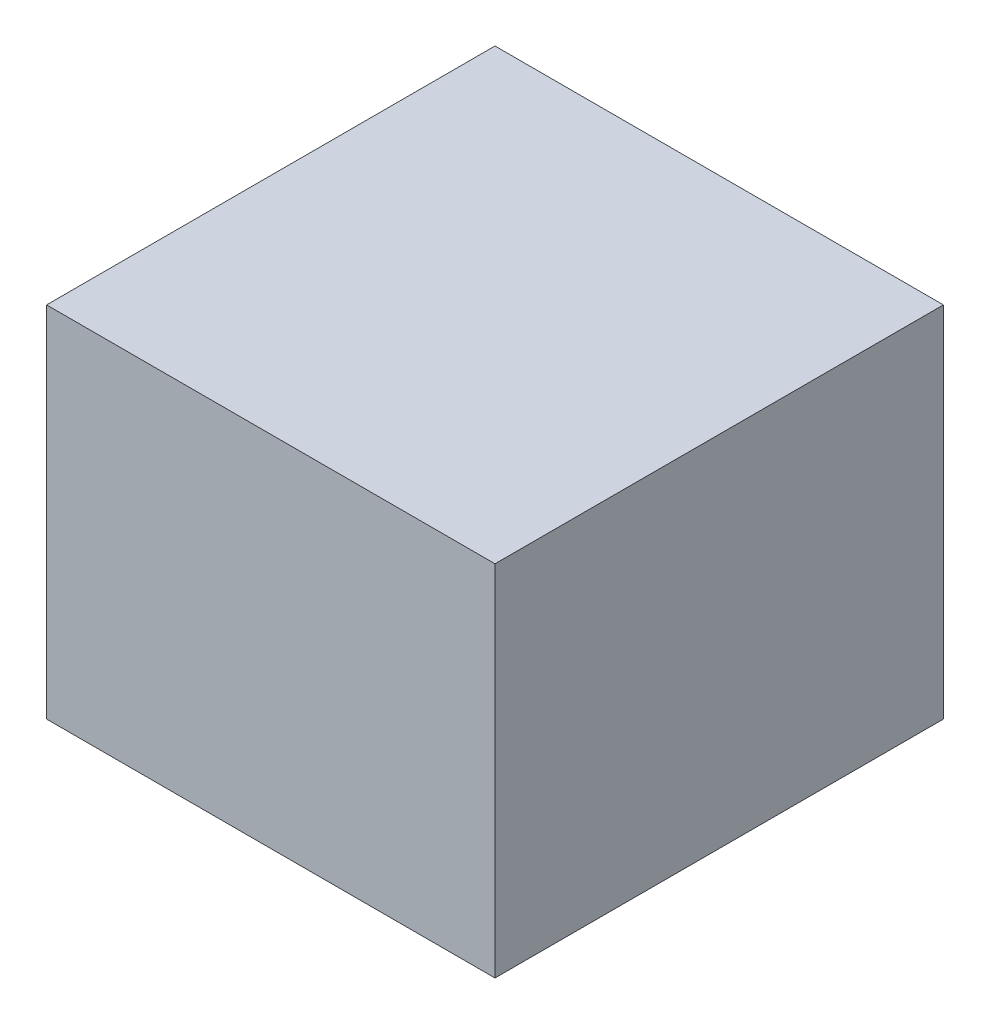
ISO-10303-21;
HEADER;
FILE_DESCRIPTION(('STEP AP214'),'2;1');
FILE_NAME('part.step','',(''),(''),'','','');
FILE_SCHEMA(('AUTOMOTIVE_DESIGN { 1 0 10303 214 1 1 1 1 }'));
ENDSEC;
DATA;
#1=APPLICATION_CONTEXT('core data for automotive mechanical design processes');
#2=APPLICATION_PROTOCOL_DEFINITION('international standard','automotive_design',2000,#1);
#3=PRODUCT_CONTEXT('',#1,'mechanical');
#4=PRODUCT('Part','Part','',(#3));
#5=PRODUCT_RELATED_PRODUCT_CATEGORY('part','',(#4));
#6=PRODUCT_DEFINITION_FORMATION('','',#4);
#7=PRODUCT_DEFINITION_CONTEXT('part definition',#1,'design');
#8=PRODUCT_DEFINITION('design','',#6,#7);
#9=PRODUCT_DEFINITION_SHAPE('','',#8);
#10=(LENGTH_UNIT() NAMED_UNIT(*) SI_UNIT(.MILLI.,.METRE.));
#11=(NAMED_UNIT(*) PLANE_ANGLE_UNIT() SI_UNIT($,.RADIAN.));
#12=(NAMED_UNIT(*) SI_UNIT($,.STERADIAN.) SOLID_ANGLE_UNIT());
#13=UNCERTAINTY_MEASURE_WITH_UNIT(LENGTH_MEASURE(1.E-05),#10,'distance_accuracy_value','');
#14=(GEOMETRIC_REPRESENTATION_CONTEXT(3) GLOBAL_UNCERTAINTY_ASSIGNED_CONTEXT((#13)) GLOBAL_UNIT_ASSIGNED_CONTEXT((#10,
#11,#12)) REPRESENTATION_CONTEXT('',''));
#15=CARTESIAN_POINT('',(0.,0.,0.));
#16=DIRECTION('',(0.,0.,1.));
#17=DIRECTION('',(1.,0.,0.));
#18=AXIS2_PLACEMENT_3D('',#15,#16,#17);
#19=CARTESIAN_POINT('',(-6.5,20.,6.5));
#20=DIRECTION('',(0.,-1.,0.));
#21=DIRECTION('',(0.,0.,-1.));
#22=AXIS2_PLACEMENT_3D('',#19,#20,#21);
#23=CYLINDRICAL_SURFACE('',#22,2.5);
#24=CARTESIAN_POINT('',(-6.5,0.,6.5));
#25=DIRECTION('',(0.,1.,0.));
#26=DIRECTION('',(0.,0.,1.));
#27=AXIS2_PLACEMENT_3D('',#24,#25,#26);
#28=CIRCLE('',#27,2.5);
#29=CARTESIAN_POINT('',(-6.5,0.,9.));
#30=VERTEX_POINT('',#29);
#31=EDGE_CURVE('E291',#30,#30,#28,.T.);
#32=ORIENTED_EDGE('',*,*,#31,.F.);
#33=EDGE_LOOP('',(#32));
#34=FACE_BOUND('',#33,.T.);
#35=CARTESIAN_POINT('',(-6.5,11.9152542372881,6.5));
#36=DIRECTION('',(0.836314214990173,0.548250429826891,0.));
#37=DIRECTION('',(0.548250429826891,-0.836314214990173,0.));
#38=AXIS2_PLACEMENT_3D('',#35,#36,#37);
#39=ELLIPSE('',#38,4.55995994529246,2.5);
#40=CARTESIAN_POINT('',(-4.73223304703363,9.21866058022079,4.73223304703363));
#41=VERTEX_POINT('',#40);
#42=CARTESIAN_POINT('',(-8.26776695296637,14.6118478943555,8.26776695296637));
#43=VERTEX_POINT('',#42);
#44=EDGE_CURVE('E280',#41,#43,#39,.T.);
#45=ORIENTED_EDGE('',*,*,#44,.T.);
#46=CARTESIAN_POINT('',(-6.5,11.9152542372881,6.5));
#47=DIRECTION('',(0.,0.548250429826891,-0.836314214990173));
#48=DIRECTION('',(0.,-0.836314214990173,-0.548250429826891));
#49=AXIS2_PLACEMENT_3D('',#46,#47,#48);
#50=ELLIPSE('',#49,4.55995994529246,2.5);
#51=EDGE_CURVE('E210',#43,#41,#50,.T.);
#52=ORIENTED_EDGE('',*,*,#51,.T.);
#53=EDGE_LOOP('',(#45,#52));
#54=FACE_BOUND('',#53,.T.);
#55=ADVANCED_FACE('F39',(#34,#54),#23,.F.);
#56=CARTESIAN_POINT('',(-6.5,20.,-6.5));
#57=DIRECTION('',(0.,-1.,0.));
#58=DIRECTION('',(0.,0.,-1.));
#59=AXIS2_PLACEMENT_3D('',#56,#57,#58);
#60=CYLINDRICAL_SURFACE('',#59,2.5);
#61=CARTESIAN_POINT('',(-6.5,0.,-6.5));
#62=DIRECTION('',(0.,1.,0.));
#63=DIRECTION('',(0.,0.,-1.));
#64=AXIS2_PLACEMENT_3D('',#61,#62,#63);
#65=CIRCLE('',#64,2.5);
#66=CARTESIAN_POINT('',(-6.5,0.,-9.));
#67=VERTEX_POINT('',#66);
#68=EDGE_CURVE('E288',#67,#67,#65,.T.);
#69=ORIENTED_EDGE('',*,*,#68,.F.);
#70=EDGE_LOOP('',(#69));
#71=FACE_BOUND('',#70,.T.);
#72=CARTESIAN_POINT('',(-6.5,11.9152542372881,-6.5));
#73=DIRECTION('',(0.,0.548250429826891,0.836314214990173));
#74=DIRECTION('',(0.,-0.836314214990173,0.548250429826891));
#75=AXIS2_PLACEMENT_3D('',#72,#73,#74);
#76=ELLIPSE('',#75,4.55995994529246,2.5);
#77=CARTESIAN_POINT('',(-4.73223304703363,9.21866058022079,-4.73223304703363));
#78=VERTEX_POINT('',#77);
#79=CARTESIAN_POINT('',(-8.26776695296637,14.6118478943555,-8.26776695296637));
#80=VERTEX_POINT('',#79);
#81=EDGE_CURVE('E207',#78,#80,#76,.T.);
#82=ORIENTED_EDGE('',*,*,#81,.T.);
#83=CARTESIAN_POINT('',(-6.5,11.9152542372881,-6.5));
#84=DIRECTION('',(0.836314214990173,0.548250429826891,0.));
#85=DIRECTION('',(0.548250429826891,-0.836314214990173,0.));
#86=AXIS2_PLACEMENT_3D('',#83,#84,#85);
#87=ELLIPSE('',#86,4.55995994529246,2.5);
#88=EDGE_CURVE('E12',#80,#78,#87,.T.);
#89=ORIENTED_EDGE('',*,*,#88,.T.);
#90=EDGE_LOOP('',(#82,#89));
#91=FACE_BOUND('',#90,.T.);
#92=ADVANCED_FACE('F327',(#71,#91),#60,.F.);
#93=CARTESIAN_POINT('',(6.5,20.,6.5));
#94=DIRECTION('',(0.,-1.,0.));
#95=DIRECTION('',(0.,0.,-1.));
#96=AXIS2_PLACEMENT_3D('',#93,#94,#95);
#97=CYLINDRICAL_SURFACE('',#96,2.5);
#98=CARTESIAN_POINT('',(6.5,0.,6.5));
#99=DIRECTION('',(0.,1.,0.));
#100=DIRECTION('',(0.,0.,-1.));
#101=AXIS2_PLACEMENT_3D('',#98,#99,#100);
#102=CIRCLE('',#101,2.5);
#103=CARTESIAN_POINT('',(6.5,0.,4.));
#104=VERTEX_POINT('',#103);
#105=EDGE_CURVE('E285',#104,#104,#102,.T.);
#106=ORIENTED_EDGE('',*,*,#105,.F.);
#107=EDGE_LOOP('',(#106));
#108=FACE_BOUND('',#107,.T.);
#109=CARTESIAN_POINT('',(6.5,11.9152542372881,6.5));
#110=DIRECTION('',(-0.836314214990173,0.548250429826891,0.));
#111=DIRECTION('',(-0.548250429826891,-0.836314214990173,0.));
#112=AXIS2_PLACEMENT_3D('',#109,#110,#111);
#113=ELLIPSE('',#112,4.55995994529246,2.5);
#114=CARTESIAN_POINT('',(8.26776695296637,14.6118478943555,8.26776695296637));
#115=VERTEX_POINT('',#114);
#116=CARTESIAN_POINT('',(4.73223304703363,9.21866058022079,4.73223304703363));
#117=VERTEX_POINT('',#116);
#118=EDGE_CURVE('E268',#115,#117,#113,.T.);
#119=ORIENTED_EDGE('',*,*,#118,.T.);
#120=CARTESIAN_POINT('',(6.5,11.9152542372881,6.5));
#121=DIRECTION('',(0.,0.548250429826891,-0.836314214990173));
#122=DIRECTION('',(0.,-0.836314214990173,-0.548250429826891));
#123=AXIS2_PLACEMENT_3D('',#120,#121,#122);
#124=ELLIPSE('',#123,4.55995994529246,2.5);
#125=EDGE_CURVE('E49',#117,#115,#124,.T.);
#126=ORIENTED_EDGE('',*,*,#125,.T.);
#127=EDGE_LOOP('',(#119,#126));
#128=FACE_BOUND('',#127,.T.);
#129=ADVANCED_FACE('F333',(#108,#128),#97,.F.);
#130=CARTESIAN_POINT('',(6.5,20.,-6.5));
#131=DIRECTION('',(0.,-1.,0.));
#132=DIRECTION('',(0.,0.,-1.));
#133=AXIS2_PLACEMENT_3D('',#130,#131,#132);
#134=CYLINDRICAL_SURFACE('',#133,2.5);
#135=CARTESIAN_POINT('',(6.5,0.,-6.5));
#136=DIRECTION('',(0.,1.,0.));
#137=DIRECTION('',(0.,0.,1.));
#138=AXIS2_PLACEMENT_3D('',#135,#136,#137);
#139=CIRCLE('',#138,2.5);
#140=CARTESIAN_POINT('',(6.5,0.,-4.));
#141=VERTEX_POINT('',#140);
#142=EDGE_CURVE('E282',#141,#141,#139,.T.);
#143=ORIENTED_EDGE('',*,*,#142,.F.);
#144=EDGE_LOOP('',(#143));
#145=FACE_BOUND('',#144,.T.);
#146=CARTESIAN_POINT('',(6.5,11.9152542372881,-6.5));
#147=DIRECTION('',(0.,0.548250429826891,0.836314214990173));
#148=DIRECTION('',(0.,-0.836314214990173,0.548250429826891));
#149=AXIS2_PLACEMENT_3D('',#146,#147,#148);
#150=ELLIPSE('',#149,4.55995994529246,2.5);
#151=CARTESIAN_POINT('',(8.26776695296636,14.6118478943555,-8.26776695296637));
#152=VERTEX_POINT('',#151);
#153=CARTESIAN_POINT('',(4.73223304703363,9.21866058022079,-4.73223304703363));
#154=VERTEX_POINT('',#153);
#155=EDGE_CURVE('E307',#152,#154,#150,.T.);
#156=ORIENTED_EDGE('',*,*,#155,.T.);
#157=CARTESIAN_POINT('',(6.5,11.9152542372881,-6.5));
#158=DIRECTION('',(-0.836314214990173,0.548250429826891,0.));
#159=DIRECTION('',(-0.548250429826891,-0.836314214990173,0.));
#160=AXIS2_PLACEMENT_3D('',#157,#158,#159);
#161=ELLIPSE('',#160,4.55995994529246,2.5);
#162=EDGE_CURVE('E310',#154,#152,#161,.T.);
#163=ORIENTED_EDGE('',*,*,#162,.T.);
#164=EDGE_LOOP('',(#156,#163));
#165=FACE_BOUND('',#164,.T.);
#166=ADVANCED_FACE('F342',(#145,#165),#134,.F.);
#167=CARTESIAN_POINT('',(0.,0.,0.));
#168=DIRECTION('',(0.,1.,0.));
#169=DIRECTION('',(0.,0.,1.));
#170=AXIS2_PLACEMENT_3D('',#167,#168,#169);
#171=PLANE('',#170);
#172=ORIENTED_EDGE('',*,*,#105,.T.);
#173=EDGE_LOOP('',(#172));
#174=FACE_BOUND('',#173,.T.);
#175=ORIENTED_EDGE('',*,*,#31,.T.);
#176=EDGE_LOOP('',(#175));
#177=FACE_BOUND('',#176,.T.);
#178=DIRECTION('',(0.,0.,-1.));
#179=VECTOR('',#178,1.);
#180=CARTESIAN_POINT('',(13.,0.,-13.));
#181=LINE('',#180,#179);
#182=CARTESIAN_POINT('',(13.,0.,13.));
#183=VERTEX_POINT('',#182);
#184=CARTESIAN_POINT('',(13.,0.,-13.));
#185=VERTEX_POINT('',#184);
#186=EDGE_CURVE('E294',#183,#185,#181,.T.);
#187=ORIENTED_EDGE('',*,*,#186,.F.);
#188=DIRECTION('',(1.,0.,0.));
#189=VECTOR('',#188,1.);
#190=CARTESIAN_POINT('',(-13.,0.,13.));
#191=LINE('',#190,#189);
#192=CARTESIAN_POINT('',(-13.,0.,13.));
#193=VERTEX_POINT('',#192);
#194=EDGE_CURVE('E300',#193,#183,#191,.T.);
#195=ORIENTED_EDGE('',*,*,#194,.F.);
#196=DIRECTION('',(0.,0.,1.));
#197=VECTOR('',#196,1.);
#198=CARTESIAN_POINT('',(-13.,0.,-13.));
#199=LINE('',#198,#197);
#200=CARTESIAN_POINT('',(-13.,0.,-13.));
#201=VERTEX_POINT('',#200);
#202=EDGE_CURVE('E131',#201,#193,#199,.T.);
#203=ORIENTED_EDGE('',*,*,#202,.F.);
#204=DIRECTION('',(-1.,0.,0.));
#205=VECTOR('',#204,1.);
#206=CARTESIAN_POINT('',(-13.,0.,-13.));
#207=LINE('',#206,#205);
#208=EDGE_CURVE('E297',#185,#201,#207,.T.);
#209=ORIENTED_EDGE('',*,*,#208,.F.);
#210=EDGE_LOOP('',(#187,#195,#203,#209));
#211=FACE_BOUND('',#210,.T.);
#212=ORIENTED_EDGE('',*,*,#68,.T.);
#213=EDGE_LOOP('',(#212));
#214=FACE_BOUND('',#213,.T.);
#215=ORIENTED_EDGE('',*,*,#142,.T.);
#216=EDGE_LOOP('',(#215));
#217=FACE_BOUND('',#216,.T.);
#218=ADVANCED_FACE('F339',(#174,#177,#211,#214,#217),#171,.F.);
#219=CARTESIAN_POINT('',(13.,20.,-13.));
#220=DIRECTION('',(-1.,0.,0.));
#221=DIRECTION('',(0.,0.,1.));
#222=AXIS2_PLACEMENT_3D('',#219,#220,#221);
#223=PLANE('',#222);
#224=ORIENTED_EDGE('',*,*,#186,.T.);
#225=DIRECTION('',(0.,-1.,0.));
#226=VECTOR('',#225,1.);
#227=CARTESIAN_POINT('',(13.,20.,-13.));
#228=LINE('',#227,#226);
#229=CARTESIAN_POINT('',(13.,20.8,-13.));
#230=VERTEX_POINT('',#229);
#231=EDGE_CURVE('E304',#230,#185,#228,.T.);
#232=ORIENTED_EDGE('',*,*,#231,.F.);
#233=DIRECTION('',(0.,0.,-1.));
#234=VECTOR('',#233,1.);
#235=CARTESIAN_POINT('',(13.,20.8,13.));
#236=LINE('',#235,#234);
#237=CARTESIAN_POINT('',(13.,20.8,13.));
#238=VERTEX_POINT('',#237);
#239=EDGE_CURVE('E144',#238,#230,#236,.T.);
#240=ORIENTED_EDGE('',*,*,#239,.F.);
#241=DIRECTION('',(0.,-1.,0.));
#242=VECTOR('',#241,1.);
#243=CARTESIAN_POINT('',(13.,20.,13.));
#244=LINE('',#243,#242);
#245=EDGE_CURVE('E135',#238,#183,#244,.T.);
#246=ORIENTED_EDGE('',*,*,#245,.T.);
#247=EDGE_LOOP('',(#224,#232,#240,#246));
#248=FACE_BOUND('',#247,.T.);
#249=ADVANCED_FACE('F41',(#248),#223,.F.);
#250=CARTESIAN_POINT('',(-13.,20.,-13.));
#251=DIRECTION('',(0.,0.,1.));
#252=DIRECTION('',(1.,0.,0.));
#253=AXIS2_PLACEMENT_3D('',#250,#251,#252);
#254=PLANE('',#253);
#255=ORIENTED_EDGE('',*,*,#208,.T.);
#256=DIRECTION('',(0.,-1.,0.));
#257=VECTOR('',#256,1.);
#258=CARTESIAN_POINT('',(-13.,20.,-13.));
#259=LINE('',#258,#257);
#260=CARTESIAN_POINT('',(-13.,20.8,-13.));
#261=VERTEX_POINT('',#260);
#262=EDGE_CURVE('E134',#261,#201,#259,.T.);
#263=ORIENTED_EDGE('',*,*,#262,.F.);
#264=DIRECTION('',(-1.,0.,0.));
#265=VECTOR('',#264,1.);
#266=CARTESIAN_POINT('',(13.,20.8,-13.));
#267=LINE('',#266,#265);
#268=EDGE_CURVE('E149',#230,#261,#267,.T.);
#269=ORIENTED_EDGE('',*,*,#268,.F.);
#270=ORIENTED_EDGE('',*,*,#231,.T.);
#271=EDGE_LOOP('',(#255,#263,#269,#270));
#272=FACE_BOUND('',#271,.T.);
#273=ADVANCED_FACE('F347',(#272),#254,.F.);
#274=CARTESIAN_POINT('',(-13.,20.,-13.));
#275=DIRECTION('',(1.,0.,0.));
#276=DIRECTION('',(0.,0.,-1.));
#277=AXIS2_PLACEMENT_3D('',#274,#275,#276);
#278=PLANE('',#277);
#279=ORIENTED_EDGE('',*,*,#202,.T.);
#280=DIRECTION('',(0.,-1.,0.));
#281=VECTOR('',#280,1.);
#282=CARTESIAN_POINT('',(-13.,20.,13.));
#283=LINE('',#282,#281);
#284=CARTESIAN_POINT('',(-13.,20.8,13.));
#285=VERTEX_POINT('',#284);
#286=EDGE_CURVE('E124',#285,#193,#283,.T.);
#287=ORIENTED_EDGE('',*,*,#286,.F.);
#288=DIRECTION('',(0.,0.,1.));
#289=VECTOR('',#288,1.);
#290=CARTESIAN_POINT('',(-13.,20.8,13.));
#291=LINE('',#290,#289);
#292=EDGE_CURVE('E129',#261,#285,#291,.T.);
#293=ORIENTED_EDGE('',*,*,#292,.F.);
#294=ORIENTED_EDGE('',*,*,#262,.T.);
#295=EDGE_LOOP('',(#279,#287,#293,#294));
#296=FACE_BOUND('',#295,.T.);
#297=ADVANCED_FACE('F126',(#296),#278,.F.);
#298=CARTESIAN_POINT('',(-13.,20.,13.));
#299=DIRECTION('',(0.,0.,-1.));
#300=DIRECTION('',(-1.,0.,0.));
#301=AXIS2_PLACEMENT_3D('',#298,#299,#300);
#302=PLANE('',#301);
#303=ORIENTED_EDGE('',*,*,#194,.T.);
#304=ORIENTED_EDGE('',*,*,#245,.F.);
#305=DIRECTION('',(1.,0.,0.));
#306=VECTOR('',#305,1.);
#307=CARTESIAN_POINT('',(13.,20.8,13.));
#308=LINE('',#307,#306);
#309=EDGE_CURVE('E138',#285,#238,#308,.T.);
#310=ORIENTED_EDGE('',*,*,#309,.F.);
#311=ORIENTED_EDGE('',*,*,#286,.T.);
#312=EDGE_LOOP('',(#303,#304,#310,#311));
#313=FACE_BOUND('',#312,.T.);
#314=ADVANCED_FACE('F139',(#313),#302,.F.);
#315=CARTESIAN_POINT('',(0.,0.601157067610741,-0.917019255677401));
#316=DIRECTION('',(0.,0.548250429826891,-0.836314214990173));
#317=DIRECTION('',(0.,0.836314214990173,0.548250429826891));
#318=AXIS2_PLACEMENT_3D('',#315,#316,#317);
#319=PLANE('',#318);
#320=DIRECTION('',(-0.48074047696003,0.733332930955978,0.48074047696003));
#321=VECTOR('',#320,1.);
#322=CARTESIAN_POINT('',(0.,2.,0.));
#323=LINE('',#322,#321);
#324=CARTESIAN_POINT('',(-11.8,20.,11.8));
#325=VERTEX_POINT('',#324);
#326=EDGE_CURVE('E57',#43,#325,#323,.T.);
#327=ORIENTED_EDGE('',*,*,#326,.T.);
#328=DIRECTION('',(1.,0.,0.));
#329=VECTOR('',#328,1.);
#330=CARTESIAN_POINT('',(-11.8,20.,11.8));
#331=LINE('',#330,#329);
#332=CARTESIAN_POINT('',(11.8,20.,11.8));
#333=VERTEX_POINT('',#332);
#334=EDGE_CURVE('E202',#325,#333,#331,.T.);
#335=ORIENTED_EDGE('',*,*,#334,.T.);
#336=DIRECTION('',(0.48074047696003,0.733332930955978,0.48074047696003));
#337=VECTOR('',#336,1.);
#338=CARTESIAN_POINT('',(0.,2.,0.));
#339=LINE('',#338,#337);
#340=EDGE_CURVE('E254',#115,#333,#339,.T.);
#341=ORIENTED_EDGE('',*,*,#340,.F.);
#342=ORIENTED_EDGE('',*,*,#125,.F.);
#343=CARTESIAN_POINT('',(0.,2.,0.));
#344=VERTEX_POINT('',#343);
#345=EDGE_CURVE('E213',#344,#117,#339,.T.);
#346=ORIENTED_EDGE('',*,*,#345,.F.);
#347=EDGE_CURVE('E212',#344,#41,#323,.T.);
#348=ORIENTED_EDGE('',*,*,#347,.T.);
#349=ORIENTED_EDGE('',*,*,#51,.F.);
#350=EDGE_LOOP('',(#327,#335,#341,#342,#346,#348,#349));
#351=FACE_BOUND('',#350,.T.);
#352=ADVANCED_FACE('F174',(#351),#319,.T.);
#353=CARTESIAN_POINT('',(0.917019255677401,0.601157067610741,0.));
#354=DIRECTION('',(0.836314214990173,0.548250429826891,0.));
#355=DIRECTION('',(-0.548250429826891,0.836314214990173,0.));
#356=AXIS2_PLACEMENT_3D('',#353,#354,#355);
#357=PLANE('',#356);
#358=ORIENTED_EDGE('',*,*,#347,.F.);
#359=DIRECTION('',(-0.48074047696003,0.733332930955978,-0.48074047696003));
#360=VECTOR('',#359,1.);
#361=CARTESIAN_POINT('',(0.,2.,0.));
#362=LINE('',#361,#360);
#363=EDGE_CURVE('E264',#344,#78,#362,.T.);
#364=ORIENTED_EDGE('',*,*,#363,.T.);
#365=ORIENTED_EDGE('',*,*,#88,.F.);
#366=CARTESIAN_POINT('',(-11.8,20.,-11.8));
#367=VERTEX_POINT('',#366);
#368=EDGE_CURVE('E65',#80,#367,#362,.T.);
#369=ORIENTED_EDGE('',*,*,#368,.T.);
#370=DIRECTION('',(0.,0.,1.));
#371=VECTOR('',#370,1.);
#372=CARTESIAN_POINT('',(-11.8,20.,11.8));
#373=LINE('',#372,#371);
#374=EDGE_CURVE('E43',#367,#325,#373,.T.);
#375=ORIENTED_EDGE('',*,*,#374,.T.);
#376=ORIENTED_EDGE('',*,*,#326,.F.);
#377=ORIENTED_EDGE('',*,*,#44,.F.);
#378=EDGE_LOOP('',(#358,#364,#365,#369,#375,#376,#377));
#379=FACE_BOUND('',#378,.T.);
#380=ADVANCED_FACE('F217',(#379),#357,.T.);
#381=CARTESIAN_POINT('',(-0.917019255677402,0.601157067610741,0.));
#382=DIRECTION('',(-0.836314214990173,0.548250429826891,0.));
#383=DIRECTION('',(-0.548250429826891,-0.836314214990173,0.));
#384=AXIS2_PLACEMENT_3D('',#381,#382,#383);
#385=PLANE('',#384);
#386=ORIENTED_EDGE('',*,*,#340,.T.);
#387=DIRECTION('',(0.,0.,-1.));
#388=VECTOR('',#387,1.);
#389=CARTESIAN_POINT('',(11.8,20.,11.8));
#390=LINE('',#389,#388);
#391=CARTESIAN_POINT('',(11.8,20.,-11.8));
#392=VERTEX_POINT('',#391);
#393=EDGE_CURVE('E203',#333,#392,#390,.T.);
#394=ORIENTED_EDGE('',*,*,#393,.T.);
#395=DIRECTION('',(0.48074047696003,0.733332930955978,-0.48074047696003));
#396=VECTOR('',#395,1.);
#397=CARTESIAN_POINT('',(0.,2.,0.));
#398=LINE('',#397,#396);
#399=EDGE_CURVE('E255',#152,#392,#398,.T.);
#400=ORIENTED_EDGE('',*,*,#399,.F.);
#401=ORIENTED_EDGE('',*,*,#162,.F.);
#402=EDGE_CURVE('E247',#344,#154,#398,.T.);
#403=ORIENTED_EDGE('',*,*,#402,.F.);
#404=ORIENTED_EDGE('',*,*,#345,.T.);
#405=ORIENTED_EDGE('',*,*,#118,.F.);
#406=EDGE_LOOP('',(#386,#394,#400,#401,#403,#404,#405));
#407=FACE_BOUND('',#406,.T.);
#408=ADVANCED_FACE('F234',(#407),#385,.T.);
#409=CARTESIAN_POINT('',(0.,0.601157067610742,0.917019255677403));
#410=DIRECTION('',(0.,0.548250429826891,0.836314214990173));
#411=DIRECTION('',(0.,-0.836314214990173,0.548250429826891));
#412=AXIS2_PLACEMENT_3D('',#409,#410,#411);
#413=PLANE('',#412);
#414=ORIENTED_EDGE('',*,*,#363,.F.);
#415=ORIENTED_EDGE('',*,*,#402,.T.);
#416=ORIENTED_EDGE('',*,*,#155,.F.);
#417=ORIENTED_EDGE('',*,*,#399,.T.);
#418=DIRECTION('',(-1.,0.,0.));
#419=VECTOR('',#418,1.);
#420=CARTESIAN_POINT('',(-11.8,20.,-11.8));
#421=LINE('',#420,#419);
#422=EDGE_CURVE('E156',#392,#367,#421,.T.);
#423=ORIENTED_EDGE('',*,*,#422,.T.);
#424=ORIENTED_EDGE('',*,*,#368,.F.);
#425=ORIENTED_EDGE('',*,*,#81,.F.);
#426=EDGE_LOOP('',(#414,#415,#416,#417,#423,#424,#425));
#427=FACE_BOUND('',#426,.T.);
#428=ADVANCED_FACE('F173',(#427),#413,.T.);
#429=CARTESIAN_POINT('',(0.,20.,0.));
#430=DIRECTION('',(0.,1.,0.));
#431=DIRECTION('',(0.,0.,1.));
#432=AXIS2_PLACEMENT_3D('',#429,#430,#431);
#433=PLANE('',#432);
#434=ORIENTED_EDGE('',*,*,#334,.F.);
#435=ORIENTED_EDGE('',*,*,#374,.F.);
#436=ORIENTED_EDGE('',*,*,#422,.F.);
#437=ORIENTED_EDGE('',*,*,#393,.F.);
#438=EDGE_LOOP('',(#434,#435,#436,#437));
#439=FACE_BOUND('',#438,.T.);
#440=ADVANCED_FACE('F163',(#439),#433,.F.);
#441=CARTESIAN_POINT('',(0.,20.8,0.));
#442=DIRECTION('',(0.,1.,0.));
#443=DIRECTION('',(0.,0.,1.));
#444=AXIS2_PLACEMENT_3D('',#441,#442,#443);
#445=PLANE('',#444);
#446=ORIENTED_EDGE('',*,*,#292,.T.);
#447=ORIENTED_EDGE('',*,*,#309,.T.);
#448=ORIENTED_EDGE('',*,*,#239,.T.);
#449=ORIENTED_EDGE('',*,*,#268,.T.);
#450=EDGE_LOOP('',(#446,#447,#448,#449));
#451=FACE_BOUND('',#450,.T.);
#452=ADVANCED_FACE('F147',(#451),#445,.T.);
#453=CLOSED_SHELL('',(#55,#92,#129,#166,#218,#249,#273,#297,#314,#352,#380,#408,#428,#440,#452));
#454=MANIFOLD_SOLID_BREP('B2',#453);
#455=ADVANCED_BREP_SHAPE_REPRESENTATION('',(#18,#454),#14);
#456=SHAPE_DEFINITION_REPRESENTATION(#9,#455);
ENDSEC;
END-ISO-10303-21;
